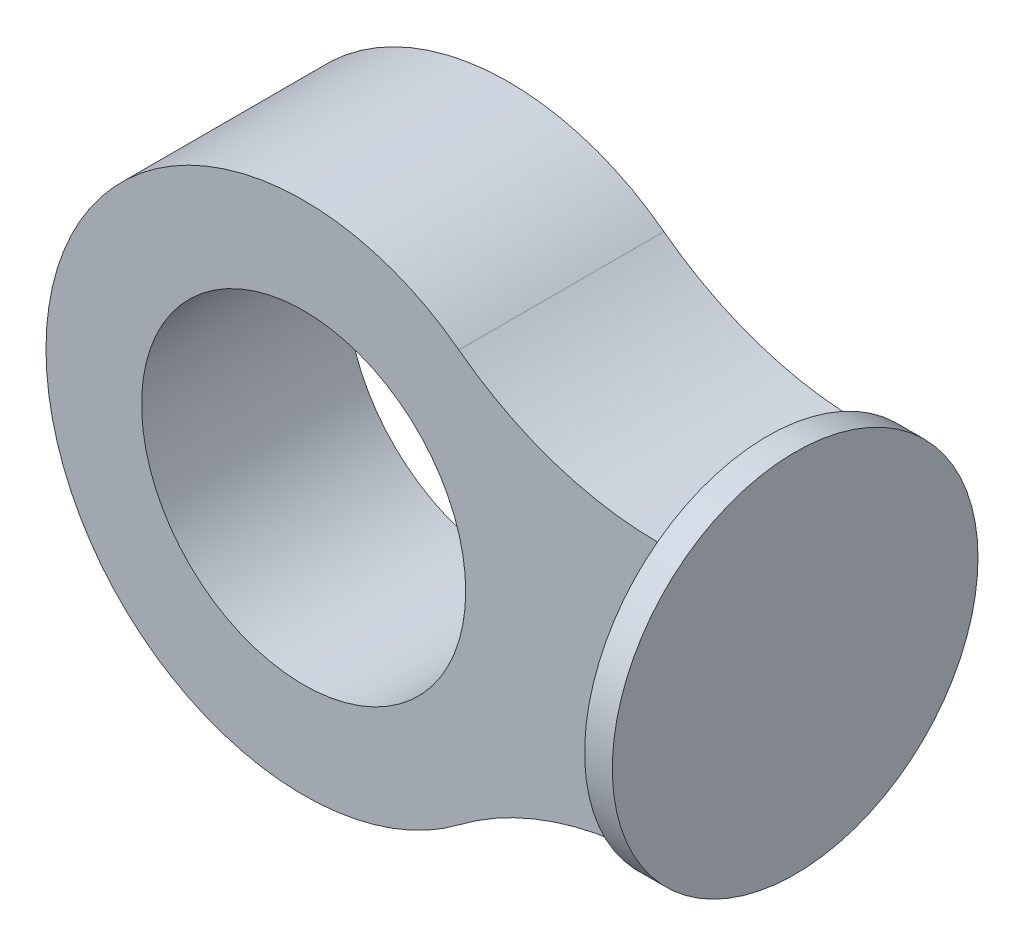
ISO-10303-21;
HEADER;
FILE_DESCRIPTION(('STEP AP214'),'2;1');
FILE_NAME('part.step','',(''),(''),'','','');
FILE_SCHEMA(('AUTOMOTIVE_DESIGN { 1 0 10303 214 1 1 1 1 }'));
ENDSEC;
DATA;
#1=APPLICATION_CONTEXT('core data for automotive mechanical design processes');
#2=APPLICATION_PROTOCOL_DEFINITION('international standard','automotive_design',2000,#1);
#3=PRODUCT_CONTEXT('',#1,'mechanical');
#4=PRODUCT('Part','Part','',(#3));
#5=PRODUCT_RELATED_PRODUCT_CATEGORY('part','',(#4));
#6=PRODUCT_DEFINITION_FORMATION('','',#4);
#7=PRODUCT_DEFINITION_CONTEXT('part definition',#1,'design');
#8=PRODUCT_DEFINITION('design','',#6,#7);
#9=PRODUCT_DEFINITION_SHAPE('','',#8);
#10=(LENGTH_UNIT() NAMED_UNIT(*) SI_UNIT(.MILLI.,.METRE.));
#11=(NAMED_UNIT(*) PLANE_ANGLE_UNIT() SI_UNIT($,.RADIAN.));
#12=(NAMED_UNIT(*) SI_UNIT($,.STERADIAN.) SOLID_ANGLE_UNIT());
#13=UNCERTAINTY_MEASURE_WITH_UNIT(LENGTH_MEASURE(1.E-05),#10,'distance_accuracy_value','');
#14=(GEOMETRIC_REPRESENTATION_CONTEXT(3) GLOBAL_UNCERTAINTY_ASSIGNED_CONTEXT((#13)) GLOBAL_UNIT_ASSIGNED_CONTEXT((#10,
#11,#12)) REPRESENTATION_CONTEXT('',''));
#15=CARTESIAN_POINT('',(0.,0.,0.));
#16=DIRECTION('',(0.,0.,1.));
#17=DIRECTION('',(1.,0.,0.));
#18=AXIS2_PLACEMENT_3D('',#15,#16,#17);
#19=CARTESIAN_POINT('',(64.1658008599597,-85.,37.));
#20=DIRECTION('',(0.,0.,1.));
#21=DIRECTION('',(1.,0.,0.));
#22=AXIS2_PLACEMENT_3D('',#19,#20,#21);
#23=PLANE('',#22);
#24=DIRECTION('',(0.,1.,0.));
#25=VECTOR('',#24,1.);
#26=CARTESIAN_POINT('',(65.2077798402307,25.,37.));
#27=LINE('',#26,#25);
#28=CARTESIAN_POINT('',(65.2077798402307,-25.,37.));
#29=VERTEX_POINT('',#28);
#30=CARTESIAN_POINT('',(65.2077798402307,25.,37.));
#31=VERTEX_POINT('',#30);
#32=EDGE_CURVE('E147',#29,#31,#27,.T.);
#33=ORIENTED_EDGE('',*,*,#32,.T.);
#34=DIRECTION('',(-1.,0.,0.));
#35=VECTOR('',#34,1.);
#36=CARTESIAN_POINT('',(64.1658008599597,25.,37.));
#37=LINE('',#36,#35);
#38=CARTESIAN_POINT('',(64.1658008599597,25.,37.));
#39=VERTEX_POINT('',#38);
#40=EDGE_CURVE('E97',#31,#39,#37,.T.);
#41=ORIENTED_EDGE('',*,*,#40,.T.);
#42=CARTESIAN_POINT('',(64.1658008599597,85.,37.));
#43=DIRECTION('',(0.,0.,-1.));
#44=DIRECTION('',(-1.,0.,0.));
#45=AXIS2_PLACEMENT_3D('',#42,#43,#44);
#46=CIRCLE('',#45,60.);
#47=CARTESIAN_POINT('',(28.0160538966021,37.112676056338,37.));
#48=VERTEX_POINT('',#47);
#49=EDGE_CURVE('E110',#39,#48,#46,.T.);
#50=ORIENTED_EDGE('',*,*,#49,.T.);
#51=CARTESIAN_POINT('',(0.,0.,37.));
#52=DIRECTION('',(0.,0.,1.));
#53=DIRECTION('',(1.,0.,0.));
#54=AXIS2_PLACEMENT_3D('',#51,#52,#53);
#55=CIRCLE('',#54,46.5);
#56=CARTESIAN_POINT('',(28.0160538966021,-37.112676056338,37.));
#57=VERTEX_POINT('',#56);
#58=EDGE_CURVE('E105',#48,#57,#55,.T.);
#59=ORIENTED_EDGE('',*,*,#58,.T.);
#60=CARTESIAN_POINT('',(64.1658008599597,-85.,37.));
#61=DIRECTION('',(0.,0.,-1.));
#62=DIRECTION('',(1.,0.,0.));
#63=AXIS2_PLACEMENT_3D('',#60,#61,#62);
#64=CIRCLE('',#63,60.);
#65=CARTESIAN_POINT('',(64.1658008599597,-25.,37.));
#66=VERTEX_POINT('',#65);
#67=EDGE_CURVE('E108',#57,#66,#64,.T.);
#68=ORIENTED_EDGE('',*,*,#67,.T.);
#69=DIRECTION('',(1.,0.,0.));
#70=VECTOR('',#69,1.);
#71=CARTESIAN_POINT('',(64.1658008599597,-25.,37.));
#72=LINE('',#71,#70);
#73=EDGE_CURVE('E61',#66,#29,#72,.T.);
#74=ORIENTED_EDGE('',*,*,#73,.T.);
#75=EDGE_LOOP('',(#33,#41,#50,#59,#68,#74));
#76=FACE_BOUND('',#75,.T.);
#77=CARTESIAN_POINT('',(0.,0.,37.));
#78=DIRECTION('',(0.,0.,1.));
#79=DIRECTION('',(1.,0.,0.));
#80=AXIS2_PLACEMENT_3D('',#77,#78,#79);
#81=CIRCLE('',#80,29.25);
#82=CARTESIAN_POINT('',(29.25,0.,37.));
#83=VERTEX_POINT('',#82);
#84=EDGE_CURVE('E133',#83,#83,#81,.T.);
#85=ORIENTED_EDGE('',*,*,#84,.F.);
#86=EDGE_LOOP('',(#85));
#87=FACE_BOUND('',#86,.T.);
#88=ADVANCED_FACE('F43',(#76,#87),#23,.T.);
#89=CARTESIAN_POINT('',(64.1658008599597,-85.,0.));
#90=DIRECTION('',(0.,0.,1.));
#91=DIRECTION('',(1.,0.,0.));
#92=AXIS2_PLACEMENT_3D('',#89,#90,#91);
#93=PLANE('',#92);
#94=DIRECTION('',(0.,1.,0.));
#95=VECTOR('',#94,1.);
#96=CARTESIAN_POINT('',(65.2077798402307,25.,0.));
#97=LINE('',#96,#95);
#98=CARTESIAN_POINT('',(65.2077798402307,-25.,0.));
#99=VERTEX_POINT('',#98);
#100=CARTESIAN_POINT('',(65.2077798402307,25.,0.));
#101=VERTEX_POINT('',#100);
#102=EDGE_CURVE('E128',#99,#101,#97,.T.);
#103=ORIENTED_EDGE('',*,*,#102,.F.);
#104=DIRECTION('',(1.,0.,0.));
#105=VECTOR('',#104,1.);
#106=CARTESIAN_POINT('',(64.1658008599597,-25.,0.));
#107=LINE('',#106,#105);
#108=CARTESIAN_POINT('',(64.1658008599597,-25.,0.));
#109=VERTEX_POINT('',#108);
#110=EDGE_CURVE('E143',#109,#99,#107,.T.);
#111=ORIENTED_EDGE('',*,*,#110,.F.);
#112=CARTESIAN_POINT('',(64.1658008599597,-85.,0.));
#113=DIRECTION('',(0.,0.,-1.));
#114=DIRECTION('',(1.,0.,0.));
#115=AXIS2_PLACEMENT_3D('',#112,#113,#114);
#116=CIRCLE('',#115,60.);
#117=CARTESIAN_POINT('',(28.0160538966021,-37.112676056338,0.));
#118=VERTEX_POINT('',#117);
#119=EDGE_CURVE('E89',#118,#109,#116,.T.);
#120=ORIENTED_EDGE('',*,*,#119,.F.);
#121=CARTESIAN_POINT('',(0.,0.,0.));
#122=DIRECTION('',(0.,0.,1.));
#123=DIRECTION('',(1.,0.,0.));
#124=AXIS2_PLACEMENT_3D('',#121,#122,#123);
#125=CIRCLE('',#124,46.5);
#126=CARTESIAN_POINT('',(28.0160538966021,37.112676056338,0.));
#127=VERTEX_POINT('',#126);
#128=EDGE_CURVE('E82',#127,#118,#125,.T.);
#129=ORIENTED_EDGE('',*,*,#128,.F.);
#130=CARTESIAN_POINT('',(64.1658008599597,85.,0.));
#131=DIRECTION('',(0.,0.,-1.));
#132=DIRECTION('',(-1.,0.,0.));
#133=AXIS2_PLACEMENT_3D('',#130,#131,#132);
#134=CIRCLE('',#133,60.);
#135=CARTESIAN_POINT('',(64.1658008599597,25.,0.));
#136=VERTEX_POINT('',#135);
#137=EDGE_CURVE('E136',#136,#127,#134,.T.);
#138=ORIENTED_EDGE('',*,*,#137,.F.);
#139=DIRECTION('',(-1.,0.,0.));
#140=VECTOR('',#139,1.);
#141=CARTESIAN_POINT('',(64.1658008599597,25.,0.));
#142=LINE('',#141,#140);
#143=EDGE_CURVE('E132',#101,#136,#142,.T.);
#144=ORIENTED_EDGE('',*,*,#143,.F.);
#145=EDGE_LOOP('',(#103,#111,#120,#129,#138,#144));
#146=FACE_BOUND('',#145,.T.);
#147=CARTESIAN_POINT('',(0.,0.,0.));
#148=DIRECTION('',(0.,0.,1.));
#149=DIRECTION('',(1.,0.,0.));
#150=AXIS2_PLACEMENT_3D('',#147,#148,#149);
#151=CIRCLE('',#150,29.25);
#152=CARTESIAN_POINT('',(29.25,0.,0.));
#153=VERTEX_POINT('',#152);
#154=EDGE_CURVE('E175',#153,#153,#151,.T.);
#155=ORIENTED_EDGE('',*,*,#154,.T.);
#156=EDGE_LOOP('',(#155));
#157=FACE_BOUND('',#156,.T.);
#158=ADVANCED_FACE('F161',(#146,#157),#93,.F.);
#159=CARTESIAN_POINT('',(64.1658008599597,25.,37.));
#160=DIRECTION('',(0.,-1.,0.));
#161=DIRECTION('',(0.,0.,-1.));
#162=AXIS2_PLACEMENT_3D('',#159,#160,#161);
#163=PLANE('',#162);
#164=ORIENTED_EDGE('',*,*,#143,.T.);
#165=DIRECTION('',(0.,0.,-1.));
#166=VECTOR('',#165,1.);
#167=CARTESIAN_POINT('',(64.1658008599597,25.,37.));
#168=LINE('',#167,#166);
#169=EDGE_CURVE('E53',#39,#136,#168,.T.);
#170=ORIENTED_EDGE('',*,*,#169,.F.);
#171=ORIENTED_EDGE('',*,*,#40,.F.);
#172=DIRECTION('',(0.,0.,-1.));
#173=VECTOR('',#172,1.);
#174=CARTESIAN_POINT('',(65.2077798402307,25.,37.));
#175=LINE('',#174,#173);
#176=EDGE_CURVE('E11',#31,#101,#175,.T.);
#177=ORIENTED_EDGE('',*,*,#176,.T.);
#178=EDGE_LOOP('',(#164,#170,#171,#177));
#179=FACE_BOUND('',#178,.T.);
#180=ADVANCED_FACE('F45',(#179),#163,.F.);
#181=CARTESIAN_POINT('',(64.1658008599597,85.,37.));
#182=DIRECTION('',(0.,0.,-1.));
#183=DIRECTION('',(-1.,0.,0.));
#184=AXIS2_PLACEMENT_3D('',#181,#182,#183);
#185=CYLINDRICAL_SURFACE('',#184,60.);
#186=ORIENTED_EDGE('',*,*,#137,.T.);
#187=DIRECTION('',(0.,0.,-1.));
#188=VECTOR('',#187,1.);
#189=CARTESIAN_POINT('',(28.0160538966021,37.112676056338,37.));
#190=LINE('',#189,#188);
#191=EDGE_CURVE('E117',#48,#127,#190,.T.);
#192=ORIENTED_EDGE('',*,*,#191,.F.);
#193=ORIENTED_EDGE('',*,*,#49,.F.);
#194=ORIENTED_EDGE('',*,*,#169,.T.);
#195=EDGE_LOOP('',(#186,#192,#193,#194));
#196=FACE_BOUND('',#195,.T.);
#197=ADVANCED_FACE('F158',(#196),#185,.F.);
#198=CARTESIAN_POINT('',(0.,0.,37.));
#199=DIRECTION('',(0.,0.,-1.));
#200=DIRECTION('',(-1.,0.,0.));
#201=AXIS2_PLACEMENT_3D('',#198,#199,#200);
#202=CYLINDRICAL_SURFACE('',#201,46.5);
#203=ORIENTED_EDGE('',*,*,#128,.T.);
#204=DIRECTION('',(0.,0.,-1.));
#205=VECTOR('',#204,1.);
#206=CARTESIAN_POINT('',(28.0160538966021,-37.112676056338,37.));
#207=LINE('',#206,#205);
#208=EDGE_CURVE('E114',#57,#118,#207,.T.);
#209=ORIENTED_EDGE('',*,*,#208,.F.);
#210=ORIENTED_EDGE('',*,*,#58,.F.);
#211=ORIENTED_EDGE('',*,*,#191,.T.);
#212=EDGE_LOOP('',(#203,#209,#210,#211));
#213=FACE_BOUND('',#212,.T.);
#214=ADVANCED_FACE('F115',(#213),#202,.T.);
#215=CARTESIAN_POINT('',(64.1658008599597,-85.,37.));
#216=DIRECTION('',(0.,0.,-1.));
#217=DIRECTION('',(-1.,0.,0.));
#218=AXIS2_PLACEMENT_3D('',#215,#216,#217);
#219=CYLINDRICAL_SURFACE('',#218,60.);
#220=ORIENTED_EDGE('',*,*,#119,.T.);
#221=DIRECTION('',(0.,0.,-1.));
#222=VECTOR('',#221,1.);
#223=CARTESIAN_POINT('',(64.1658008599597,-25.,37.));
#224=LINE('',#223,#222);
#225=EDGE_CURVE('E118',#66,#109,#224,.T.);
#226=ORIENTED_EDGE('',*,*,#225,.F.);
#227=ORIENTED_EDGE('',*,*,#67,.F.);
#228=ORIENTED_EDGE('',*,*,#208,.T.);
#229=EDGE_LOOP('',(#220,#226,#227,#228));
#230=FACE_BOUND('',#229,.T.);
#231=ADVANCED_FACE('F120',(#230),#219,.F.);
#232=CARTESIAN_POINT('',(64.1658008599597,-25.,37.));
#233=DIRECTION('',(0.,1.,0.));
#234=DIRECTION('',(0.,0.,1.));
#235=AXIS2_PLACEMENT_3D('',#232,#233,#234);
#236=PLANE('',#235);
#237=ORIENTED_EDGE('',*,*,#110,.T.);
#238=DIRECTION('',(0.,0.,-1.));
#239=VECTOR('',#238,1.);
#240=CARTESIAN_POINT('',(65.2077798402307,-25.,37.));
#241=LINE('',#240,#239);
#242=EDGE_CURVE('E124',#29,#99,#241,.T.);
#243=ORIENTED_EDGE('',*,*,#242,.F.);
#244=ORIENTED_EDGE('',*,*,#73,.F.);
#245=ORIENTED_EDGE('',*,*,#225,.T.);
#246=EDGE_LOOP('',(#237,#243,#244,#245));
#247=FACE_BOUND('',#246,.T.);
#248=ADVANCED_FACE('F165',(#247),#236,.F.);
#249=CARTESIAN_POINT('',(0.,0.,37.));
#250=DIRECTION('',(0.,0.,-1.));
#251=DIRECTION('',(-1.,0.,0.));
#252=AXIS2_PLACEMENT_3D('',#249,#250,#251);
#253=CYLINDRICAL_SURFACE('',#252,29.25);
#254=ORIENTED_EDGE('',*,*,#84,.T.);
#255=EDGE_LOOP('',(#254));
#256=FACE_BOUND('',#255,.T.);
#257=ORIENTED_EDGE('',*,*,#154,.F.);
#258=EDGE_LOOP('',(#257));
#259=FACE_BOUND('',#258,.T.);
#260=ADVANCED_FACE('F201',(#256,#259),#253,.F.);
#261=CARTESIAN_POINT('',(65.2077798402307,0.,18.5));
#262=DIRECTION('',(1.,0.,0.));
#263=DIRECTION('',(0.,0.,-1.));
#264=AXIS2_PLACEMENT_3D('',#261,#262,#263);
#265=PLANE('',#264);
#266=CARTESIAN_POINT('',(65.2077798402307,0.,18.5));
#267=DIRECTION('',(1.,0.,0.));
#268=DIRECTION('',(0.,0.,-1.));
#269=AXIS2_PLACEMENT_3D('',#266,#267,#268);
#270=CIRCLE('',#269,33.);
#271=CARTESIAN_POINT('',(65.2077798402307,0.,-14.5));
#272=VERTEX_POINT('',#271);
#273=EDGE_CURVE('E184',#272,#272,#270,.T.);
#274=ORIENTED_EDGE('',*,*,#273,.F.);
#275=EDGE_LOOP('',(#274));
#276=FACE_BOUND('',#275,.T.);
#277=ORIENTED_EDGE('',*,*,#242,.T.);
#278=ORIENTED_EDGE('',*,*,#102,.T.);
#279=ORIENTED_EDGE('',*,*,#176,.F.);
#280=ORIENTED_EDGE('',*,*,#32,.F.);
#281=EDGE_LOOP('',(#277,#278,#279,#280));
#282=FACE_BOUND('',#281,.T.);
#283=ADVANCED_FACE('F168',(#276,#282),#265,.F.);
#284=CARTESIAN_POINT('',(70.2077798402307,0.,18.5));
#285=DIRECTION('',(-1.,0.,0.));
#286=DIRECTION('',(0.,0.,1.));
#287=AXIS2_PLACEMENT_3D('',#284,#285,#286);
#288=CYLINDRICAL_SURFACE('',#287,33.);
#289=CARTESIAN_POINT('',(70.2077798402307,0.,18.5));
#290=DIRECTION('',(1.,0.,0.));
#291=DIRECTION('',(0.,0.,-1.));
#292=AXIS2_PLACEMENT_3D('',#289,#290,#291);
#293=CIRCLE('',#292,33.);
#294=CARTESIAN_POINT('',(70.2077798402307,0.,-14.5));
#295=VERTEX_POINT('',#294);
#296=EDGE_CURVE('E180',#295,#295,#293,.T.);
#297=ORIENTED_EDGE('',*,*,#296,.F.);
#298=EDGE_LOOP('',(#297));
#299=FACE_BOUND('',#298,.T.);
#300=ORIENTED_EDGE('',*,*,#273,.T.);
#301=EDGE_LOOP('',(#300));
#302=FACE_BOUND('',#301,.T.);
#303=ADVANCED_FACE('F194',(#299,#302),#288,.T.);
#304=CARTESIAN_POINT('',(70.2077798402307,0.,18.5));
#305=DIRECTION('',(1.,0.,0.));
#306=DIRECTION('',(0.,0.,-1.));
#307=AXIS2_PLACEMENT_3D('',#304,#305,#306);
#308=PLANE('',#307);
#309=ORIENTED_EDGE('',*,*,#296,.T.);
#310=EDGE_LOOP('',(#309));
#311=FACE_BOUND('',#310,.T.);
#312=ADVANCED_FACE('F192',(#311),#308,.T.);
#313=CLOSED_SHELL('',(#88,#158,#180,#197,#214,#231,#248,#260,#283,#303,#312));
#314=MANIFOLD_SOLID_BREP('B2',#313);
#315=ADVANCED_BREP_SHAPE_REPRESENTATION('',(#18,#314),#14);
#316=SHAPE_DEFINITION_REPRESENTATION(#9,#315);
ENDSEC;
END-ISO-10303-21;
